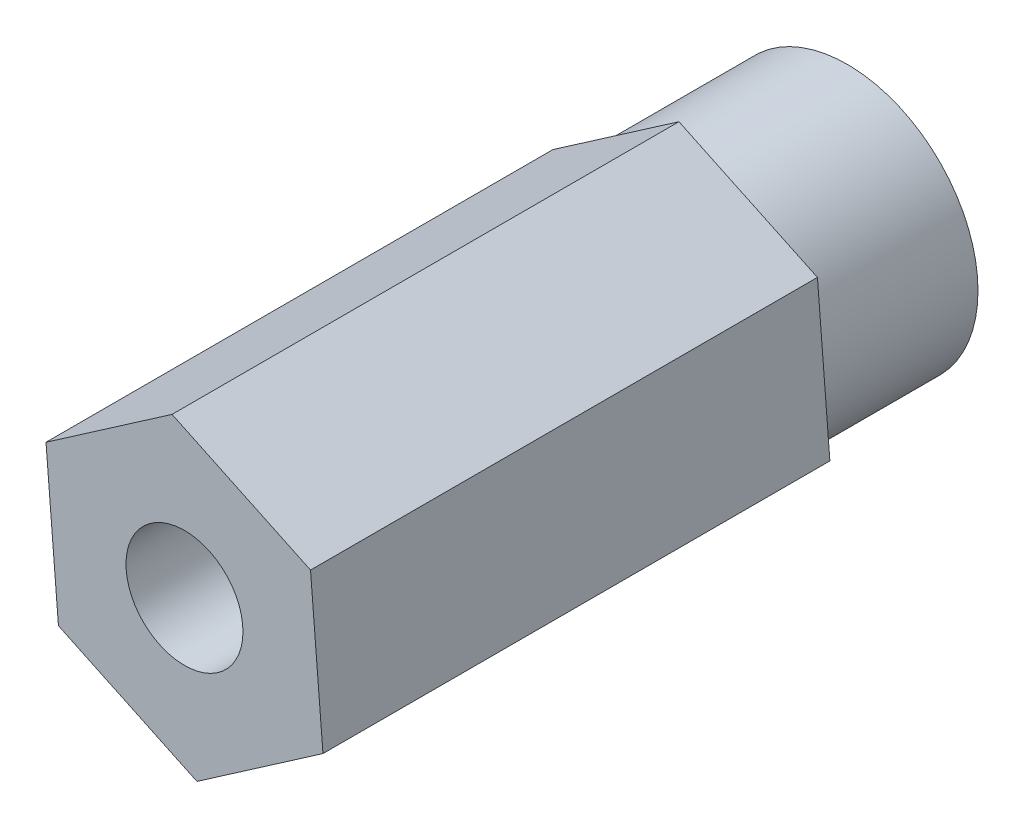
ISO-10303-21;
HEADER;
FILE_DESCRIPTION(('STEP AP214'),'2;1');
FILE_NAME('part.step','',(''),(''),'','','');
FILE_SCHEMA(('AUTOMOTIVE_DESIGN { 1 0 10303 214 1 1 1 1 }'));
ENDSEC;
DATA;
#1=APPLICATION_CONTEXT('core data for automotive mechanical design processes');
#2=APPLICATION_PROTOCOL_DEFINITION('international standard','automotive_design',2000,#1);
#3=PRODUCT_CONTEXT('',#1,'mechanical');
#4=PRODUCT('Part','Part','',(#3));
#5=PRODUCT_RELATED_PRODUCT_CATEGORY('part','',(#4));
#6=PRODUCT_DEFINITION_FORMATION('','',#4);
#7=PRODUCT_DEFINITION_CONTEXT('part definition',#1,'design');
#8=PRODUCT_DEFINITION('design','',#6,#7);
#9=PRODUCT_DEFINITION_SHAPE('','',#8);
#10=(LENGTH_UNIT() NAMED_UNIT(*) SI_UNIT(.MILLI.,.METRE.));
#11=(NAMED_UNIT(*) PLANE_ANGLE_UNIT() SI_UNIT($,.RADIAN.));
#12=(NAMED_UNIT(*) SI_UNIT($,.STERADIAN.) SOLID_ANGLE_UNIT());
#13=UNCERTAINTY_MEASURE_WITH_UNIT(LENGTH_MEASURE(1.E-05),#10,'distance_accuracy_value','');
#14=(GEOMETRIC_REPRESENTATION_CONTEXT(3) GLOBAL_UNCERTAINTY_ASSIGNED_CONTEXT((#13)) GLOBAL_UNIT_ASSIGNED_CONTEXT((#10,
#11,#12)) REPRESENTATION_CONTEXT('',''));
#15=CARTESIAN_POINT('',(0.,0.,0.));
#16=DIRECTION('',(0.,0.,1.));
#17=DIRECTION('',(1.,0.,0.));
#18=AXIS2_PLACEMENT_3D('',#15,#16,#17);
#19=CARTESIAN_POINT('',(0.,0.,0.));
#20=DIRECTION('',(0.,0.,1.));
#21=DIRECTION('',(1.,0.,0.));
#22=AXIS2_PLACEMENT_3D('',#19,#20,#21);
#23=PLANE('',#22);
#24=CARTESIAN_POINT('',(0.,0.,0.));
#25=DIRECTION('',(0.,0.,1.));
#26=DIRECTION('',(1.,0.,0.));
#27=AXIS2_PLACEMENT_3D('',#24,#25,#26);
#28=CIRCLE('',#27,3.35);
#29=CARTESIAN_POINT('',(3.35,0.,0.));
#30=VERTEX_POINT('',#29);
#31=EDGE_CURVE('E41',#30,#30,#28,.T.);
#32=ORIENTED_EDGE('',*,*,#31,.F.);
#33=EDGE_LOOP('',(#32));
#34=FACE_BOUND('',#33,.T.);
#35=CARTESIAN_POINT('',(0.,0.,0.));
#36=DIRECTION('',(0.,0.,1.));
#37=DIRECTION('',(1.,0.,0.));
#38=AXIS2_PLACEMENT_3D('',#35,#36,#37);
#39=CIRCLE('',#38,1.5);
#40=CARTESIAN_POINT('',(1.5,0.,0.));
#41=VERTEX_POINT('',#40);
#42=EDGE_CURVE('E144',#41,#41,#39,.T.);
#43=ORIENTED_EDGE('',*,*,#42,.T.);
#44=EDGE_LOOP('',(#43));
#45=FACE_BOUND('',#44,.T.);
#46=ADVANCED_FACE('F37',(#34,#45),#23,.F.);
#47=CARTESIAN_POINT('',(0.,0.,4.));
#48=DIRECTION('',(0.,0.,-1.));
#49=DIRECTION('',(-1.,0.,0.));
#50=AXIS2_PLACEMENT_3D('',#47,#48,#49);
#51=CYLINDRICAL_SURFACE('',#50,3.35);
#52=CARTESIAN_POINT('',(0.,0.,4.));
#53=DIRECTION('',(0.,0.,1.));
#54=DIRECTION('',(1.,0.,0.));
#55=AXIS2_PLACEMENT_3D('',#52,#53,#54);
#56=CIRCLE('',#55,3.35);
#57=CARTESIAN_POINT('',(3.35,0.,4.));
#58=VERTEX_POINT('',#57);
#59=EDGE_CURVE('E11',#58,#58,#56,.T.);
#60=ORIENTED_EDGE('',*,*,#59,.F.);
#61=EDGE_LOOP('',(#60));
#62=FACE_BOUND('',#61,.T.);
#63=ORIENTED_EDGE('',*,*,#31,.T.);
#64=EDGE_LOOP('',(#63));
#65=FACE_BOUND('',#64,.T.);
#66=ADVANCED_FACE('F39',(#62,#65),#51,.T.);
#67=CARTESIAN_POINT('',(0.,0.,4.));
#68=DIRECTION('',(0.,0.,-1.));
#69=DIRECTION('',(-1.,0.,0.));
#70=AXIS2_PLACEMENT_3D('',#67,#68,#69);
#71=CYLINDRICAL_SURFACE('',#70,1.5);
#72=ORIENTED_EDGE('',*,*,#42,.F.);
#73=EDGE_LOOP('',(#72));
#74=FACE_BOUND('',#73,.T.);
#75=CARTESIAN_POINT('',(0.,0.,17.));
#76=DIRECTION('',(0.,0.,1.));
#77=DIRECTION('',(1.,0.,0.));
#78=AXIS2_PLACEMENT_3D('',#75,#76,#77);
#79=CIRCLE('',#78,1.5);
#80=CARTESIAN_POINT('',(1.5,0.,17.));
#81=VERTEX_POINT('',#80);
#82=EDGE_CURVE('E128',#81,#81,#79,.T.);
#83=ORIENTED_EDGE('',*,*,#82,.T.);
#84=EDGE_LOOP('',(#83));
#85=FACE_BOUND('',#84,.T.);
#86=ADVANCED_FACE('F156',(#74,#85),#71,.F.);
#87=CARTESIAN_POINT('',(0.,0.,17.));
#88=DIRECTION('',(0.,0.,1.));
#89=DIRECTION('',(1.,0.,0.));
#90=AXIS2_PLACEMENT_3D('',#87,#88,#89);
#91=PLANE('',#90);
#92=DIRECTION('',(0.822548724131617,0.56869464251868,0.));
#93=VECTOR('',#92,1.);
#94=CARTESIAN_POINT('',(0.319189978377217,-3.91649114919458,17.));
#95=LINE('',#94,#93);
#96=CARTESIAN_POINT('',(0.319189978377217,-3.91649114919458,17.));
#97=VERTEX_POINT('',#96);
#98=CARTESIAN_POINT('',(3.55137581808803,-1.68181894468921,17.));
#99=VERTEX_POINT('',#98);
#100=EDGE_CURVE('E135',#97,#99,#95,.T.);
#101=ORIENTED_EDGE('',*,*,#100,.T.);
#102=DIRECTION('',(-0.0812296453514785,0.996695412207798,0.));
#103=VECTOR('',#102,1.);
#104=CARTESIAN_POINT('',(3.55137581808803,-1.68181894468921,17.));
#105=LINE('',#104,#103);
#106=CARTESIAN_POINT('',(3.23218583971081,2.23467220450537,17.));
#107=VERTEX_POINT('',#106);
#108=EDGE_CURVE('E92',#99,#107,#105,.T.);
#109=ORIENTED_EDGE('',*,*,#108,.T.);
#110=DIRECTION('',(-0.903778369483095,0.428000769689118,0.));
#111=VECTOR('',#110,1.);
#112=CARTESIAN_POINT('',(3.23218583971081,2.23467220450537,17.));
#113=LINE('',#112,#111);
#114=CARTESIAN_POINT('',(-0.319189978377217,3.91649114919458,17.));
#115=VERTEX_POINT('',#114);
#116=EDGE_CURVE('E106',#107,#115,#113,.T.);
#117=ORIENTED_EDGE('',*,*,#116,.T.);
#118=DIRECTION('',(-0.822548724131617,-0.56869464251868,0.));
#119=VECTOR('',#118,1.);
#120=CARTESIAN_POINT('',(-0.319189978377217,3.91649114919458,17.));
#121=LINE('',#120,#119);
#122=CARTESIAN_POINT('',(-3.55137581808803,1.68181894468921,17.));
#123=VERTEX_POINT('',#122);
#124=EDGE_CURVE('E99',#115,#123,#121,.T.);
#125=ORIENTED_EDGE('',*,*,#124,.T.);
#126=DIRECTION('',(0.0812296453514783,-0.996695412207798,0.));
#127=VECTOR('',#126,1.);
#128=CARTESIAN_POINT('',(-3.55137581808803,1.68181894468921,17.));
#129=LINE('',#128,#127);
#130=CARTESIAN_POINT('',(-3.23218583971081,-2.23467220450537,17.));
#131=VERTEX_POINT('',#130);
#132=EDGE_CURVE('E104',#123,#131,#129,.T.);
#133=ORIENTED_EDGE('',*,*,#132,.T.);
#134=DIRECTION('',(0.903778369483096,-0.428000769689118,0.));
#135=VECTOR('',#134,1.);
#136=CARTESIAN_POINT('',(-3.23218583971081,-2.23467220450537,17.));
#137=LINE('',#136,#135);
#138=EDGE_CURVE('E54',#131,#97,#137,.T.);
#139=ORIENTED_EDGE('',*,*,#138,.T.);
#140=EDGE_LOOP('',(#101,#109,#117,#125,#133,#139));
#141=FACE_BOUND('',#140,.T.);
#142=ORIENTED_EDGE('',*,*,#82,.F.);
#143=EDGE_LOOP('',(#142));
#144=FACE_BOUND('',#143,.T.);
#145=ADVANCED_FACE('F101',(#141,#144),#91,.T.);
#146=CARTESIAN_POINT('',(0.,0.,4.));
#147=DIRECTION('',(0.,0.,1.));
#148=DIRECTION('',(1.,0.,0.));
#149=AXIS2_PLACEMENT_3D('',#146,#147,#148);
#150=PLANE('',#149);
#151=ORIENTED_EDGE('',*,*,#59,.T.);
#152=EDGE_LOOP('',(#151));
#153=FACE_BOUND('',#152,.T.);
#154=DIRECTION('',(0.822548724131617,0.56869464251868,0.));
#155=VECTOR('',#154,1.);
#156=CARTESIAN_POINT('',(0.319189978377217,-3.91649114919458,4.));
#157=LINE('',#156,#155);
#158=CARTESIAN_POINT('',(0.319189978377217,-3.91649114919458,4.));
#159=VERTEX_POINT('',#158);
#160=CARTESIAN_POINT('',(3.55137581808803,-1.68181894468921,4.));
#161=VERTEX_POINT('',#160);
#162=EDGE_CURVE('E124',#159,#161,#157,.T.);
#163=ORIENTED_EDGE('',*,*,#162,.F.);
#164=DIRECTION('',(0.903778369483096,-0.428000769689118,0.));
#165=VECTOR('',#164,1.);
#166=CARTESIAN_POINT('',(-3.23218583971081,-2.23467220450537,4.));
#167=LINE('',#166,#165);
#168=CARTESIAN_POINT('',(-3.23218583971081,-2.23467220450537,4.));
#169=VERTEX_POINT('',#168);
#170=EDGE_CURVE('E83',#169,#159,#167,.T.);
#171=ORIENTED_EDGE('',*,*,#170,.F.);
#172=DIRECTION('',(0.0812296453514783,-0.996695412207798,0.));
#173=VECTOR('',#172,1.);
#174=CARTESIAN_POINT('',(-3.55137581808803,1.68181894468921,4.));
#175=LINE('',#174,#173);
#176=CARTESIAN_POINT('',(-3.55137581808803,1.68181894468921,4.));
#177=VERTEX_POINT('',#176);
#178=EDGE_CURVE('E77',#177,#169,#175,.T.);
#179=ORIENTED_EDGE('',*,*,#178,.F.);
#180=DIRECTION('',(-0.822548724131617,-0.56869464251868,0.));
#181=VECTOR('',#180,1.);
#182=CARTESIAN_POINT('',(-0.319189978377217,3.91649114919458,4.));
#183=LINE('',#182,#181);
#184=CARTESIAN_POINT('',(-0.319189978377217,3.91649114919458,4.));
#185=VERTEX_POINT('',#184);
#186=EDGE_CURVE('E114',#185,#177,#183,.T.);
#187=ORIENTED_EDGE('',*,*,#186,.F.);
#188=DIRECTION('',(-0.903778369483095,0.428000769689118,0.));
#189=VECTOR('',#188,1.);
#190=CARTESIAN_POINT('',(3.23218583971081,2.23467220450537,4.));
#191=LINE('',#190,#189);
#192=CARTESIAN_POINT('',(3.23218583971081,2.23467220450537,4.));
#193=VERTEX_POINT('',#192);
#194=EDGE_CURVE('E130',#193,#185,#191,.T.);
#195=ORIENTED_EDGE('',*,*,#194,.F.);
#196=DIRECTION('',(-0.0812296453514785,0.996695412207798,0.));
#197=VECTOR('',#196,1.);
#198=CARTESIAN_POINT('',(3.55137581808803,-1.68181894468921,4.));
#199=LINE('',#198,#197);
#200=EDGE_CURVE('E127',#161,#193,#199,.T.);
#201=ORIENTED_EDGE('',*,*,#200,.F.);
#202=EDGE_LOOP('',(#163,#171,#179,#187,#195,#201));
#203=FACE_BOUND('',#202,.T.);
#204=ADVANCED_FACE('F166',(#153,#203),#150,.F.);
#205=CARTESIAN_POINT('',(0.319189978377217,-3.91649114919458,17.));
#206=DIRECTION('',(-0.568694642518679,0.822548724131617,0.));
#207=DIRECTION('',(-0.822548724131617,-0.568694642518679,0.));
#208=AXIS2_PLACEMENT_3D('',#205,#206,#207);
#209=PLANE('',#208);
#210=ORIENTED_EDGE('',*,*,#162,.T.);
#211=DIRECTION('',(0.,0.,-1.));
#212=VECTOR('',#211,1.);
#213=CARTESIAN_POINT('',(3.55137581808803,-1.68181894468921,17.));
#214=LINE('',#213,#212);
#215=EDGE_CURVE('E142',#99,#161,#214,.T.);
#216=ORIENTED_EDGE('',*,*,#215,.F.);
#217=ORIENTED_EDGE('',*,*,#100,.F.);
#218=DIRECTION('',(0.,0.,-1.));
#219=VECTOR('',#218,1.);
#220=CARTESIAN_POINT('',(0.319189978377217,-3.91649114919458,17.));
#221=LINE('',#220,#219);
#222=EDGE_CURVE('E120',#97,#159,#221,.T.);
#223=ORIENTED_EDGE('',*,*,#222,.T.);
#224=EDGE_LOOP('',(#210,#216,#217,#223));
#225=FACE_BOUND('',#224,.T.);
#226=ADVANCED_FACE('F162',(#225),#209,.F.);
#227=CARTESIAN_POINT('',(3.55137581808803,-1.68181894468921,17.));
#228=DIRECTION('',(-0.996695412207798,-0.0812296453514784,0.));
#229=DIRECTION('',(0.0812296453514785,-0.996695412207798,0.));
#230=AXIS2_PLACEMENT_3D('',#227,#228,#229);
#231=PLANE('',#230);
#232=ORIENTED_EDGE('',*,*,#200,.T.);
#233=DIRECTION('',(0.,0.,-1.));
#234=VECTOR('',#233,1.);
#235=CARTESIAN_POINT('',(3.23218583971081,2.23467220450537,17.));
#236=LINE('',#235,#234);
#237=EDGE_CURVE('E139',#107,#193,#236,.T.);
#238=ORIENTED_EDGE('',*,*,#237,.F.);
#239=ORIENTED_EDGE('',*,*,#108,.F.);
#240=ORIENTED_EDGE('',*,*,#215,.T.);
#241=EDGE_LOOP('',(#232,#238,#239,#240));
#242=FACE_BOUND('',#241,.T.);
#243=ADVANCED_FACE('F165',(#242),#231,.F.);
#244=CARTESIAN_POINT('',(3.23218583971081,2.23467220450537,17.));
#245=DIRECTION('',(-0.428000769689118,-0.903778369483095,0.));
#246=DIRECTION('',(0.903778369483095,-0.428000769689119,0.));
#247=AXIS2_PLACEMENT_3D('',#244,#245,#246);
#248=PLANE('',#247);
#249=ORIENTED_EDGE('',*,*,#194,.T.);
#250=DIRECTION('',(0.,0.,-1.));
#251=VECTOR('',#250,1.);
#252=CARTESIAN_POINT('',(-0.319189978377217,3.91649114919458,17.));
#253=LINE('',#252,#251);
#254=EDGE_CURVE('E115',#115,#185,#253,.T.);
#255=ORIENTED_EDGE('',*,*,#254,.F.);
#256=ORIENTED_EDGE('',*,*,#116,.F.);
#257=ORIENTED_EDGE('',*,*,#237,.T.);
#258=EDGE_LOOP('',(#249,#255,#256,#257));
#259=FACE_BOUND('',#258,.T.);
#260=ADVANCED_FACE('F170',(#259),#248,.F.);
#261=CARTESIAN_POINT('',(-0.319189978377217,3.91649114919458,17.));
#262=DIRECTION('',(0.56869464251868,-0.822548724131617,0.));
#263=DIRECTION('',(0.822548724131617,0.56869464251868,0.));
#264=AXIS2_PLACEMENT_3D('',#261,#262,#263);
#265=PLANE('',#264);
#266=ORIENTED_EDGE('',*,*,#186,.T.);
#267=DIRECTION('',(0.,0.,-1.));
#268=VECTOR('',#267,1.);
#269=CARTESIAN_POINT('',(-3.55137581808803,1.68181894468921,17.));
#270=LINE('',#269,#268);
#271=EDGE_CURVE('E111',#123,#177,#270,.T.);
#272=ORIENTED_EDGE('',*,*,#271,.F.);
#273=ORIENTED_EDGE('',*,*,#124,.F.);
#274=ORIENTED_EDGE('',*,*,#254,.T.);
#275=EDGE_LOOP('',(#266,#272,#273,#274));
#276=FACE_BOUND('',#275,.T.);
#277=ADVANCED_FACE('F112',(#276),#265,.F.);
#278=CARTESIAN_POINT('',(-3.55137581808803,1.68181894468921,17.));
#279=DIRECTION('',(0.996695412207798,0.0812296453514783,0.));
#280=DIRECTION('',(-0.0812296453514783,0.996695412207798,0.));
#281=AXIS2_PLACEMENT_3D('',#278,#279,#280);
#282=PLANE('',#281);
#283=ORIENTED_EDGE('',*,*,#178,.T.);
#284=DIRECTION('',(0.,0.,-1.));
#285=VECTOR('',#284,1.);
#286=CARTESIAN_POINT('',(-3.23218583971081,-2.23467220450537,17.));
#287=LINE('',#286,#285);
#288=EDGE_CURVE('E116',#131,#169,#287,.T.);
#289=ORIENTED_EDGE('',*,*,#288,.F.);
#290=ORIENTED_EDGE('',*,*,#132,.F.);
#291=ORIENTED_EDGE('',*,*,#271,.T.);
#292=EDGE_LOOP('',(#283,#289,#290,#291));
#293=FACE_BOUND('',#292,.T.);
#294=ADVANCED_FACE('F118',(#293),#282,.F.);
#295=CARTESIAN_POINT('',(-3.23218583971081,-2.23467220450537,17.));
#296=DIRECTION('',(0.428000769689118,0.903778369483096,0.));
#297=DIRECTION('',(-0.903778369483096,0.428000769689118,0.));
#298=AXIS2_PLACEMENT_3D('',#295,#296,#297);
#299=PLANE('',#298);
#300=ORIENTED_EDGE('',*,*,#170,.T.);
#301=ORIENTED_EDGE('',*,*,#222,.F.);
#302=ORIENTED_EDGE('',*,*,#138,.F.);
#303=ORIENTED_EDGE('',*,*,#288,.T.);
#304=EDGE_LOOP('',(#300,#301,#302,#303));
#305=FACE_BOUND('',#304,.T.);
#306=ADVANCED_FACE('F178',(#305),#299,.F.);
#307=CLOSED_SHELL('',(#46,#66,#86,#145,#204,#226,#243,#260,#277,#294,#306));
#308=MANIFOLD_SOLID_BREP('B2',#307);
#309=ADVANCED_BREP_SHAPE_REPRESENTATION('',(#18,#308),#14);
#310=SHAPE_DEFINITION_REPRESENTATION(#9,#309);
ENDSEC;
END-ISO-10303-21;
